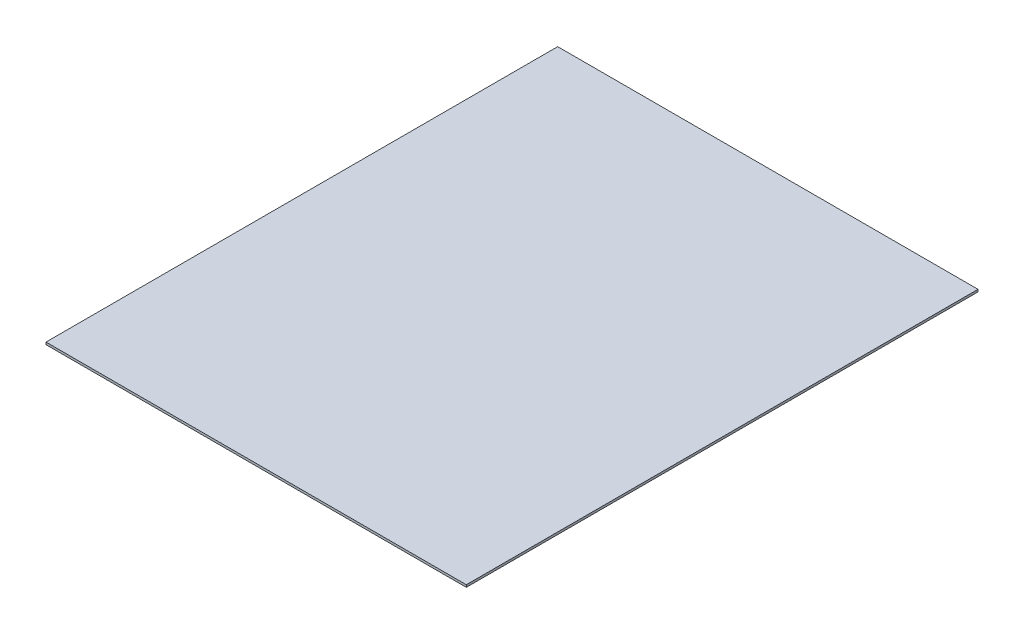
ISO-10303-21;
HEADER;
FILE_DESCRIPTION(('STEP AP214'),'2;1');
FILE_NAME('part.step','',(''),(''),'','','');
FILE_SCHEMA(('AUTOMOTIVE_DESIGN { 1 0 10303 214 1 1 1 1 }'));
ENDSEC;
DATA;
#1=APPLICATION_CONTEXT('core data for automotive mechanical design processes');
#2=APPLICATION_PROTOCOL_DEFINITION('international standard','automotive_design',2000,#1);
#3=PRODUCT_CONTEXT('',#1,'mechanical');
#4=PRODUCT('Part','Part','',(#3));
#5=PRODUCT_RELATED_PRODUCT_CATEGORY('part','',(#4));
#6=PRODUCT_DEFINITION_FORMATION('','',#4);
#7=PRODUCT_DEFINITION_CONTEXT('part definition',#1,'design');
#8=PRODUCT_DEFINITION('design','',#6,#7);
#9=PRODUCT_DEFINITION_SHAPE('','',#8);
#10=(LENGTH_UNIT() NAMED_UNIT(*) SI_UNIT(.MILLI.,.METRE.));
#11=(NAMED_UNIT(*) PLANE_ANGLE_UNIT() SI_UNIT($,.RADIAN.));
#12=(NAMED_UNIT(*) SI_UNIT($,.STERADIAN.) SOLID_ANGLE_UNIT());
#13=UNCERTAINTY_MEASURE_WITH_UNIT(LENGTH_MEASURE(1.E-05),#10,'distance_accuracy_value','');
#14=(GEOMETRIC_REPRESENTATION_CONTEXT(3) GLOBAL_UNCERTAINTY_ASSIGNED_CONTEXT((#13)) GLOBAL_UNIT_ASSIGNED_CONTEXT((#10,
#11,#12)) REPRESENTATION_CONTEXT('',''));
#15=CARTESIAN_POINT('',(0.,0.,0.));
#16=DIRECTION('',(0.,0.,1.));
#17=DIRECTION('',(1.,0.,0.));
#18=AXIS2_PLACEMENT_3D('',#15,#16,#17);
#19=CARTESIAN_POINT('',(-292.1,-28.5749999999999,-355.6));
#20=DIRECTION('',(-1.,0.,0.));
#21=DIRECTION('',(0.,0.,1.));
#22=AXIS2_PLACEMENT_3D('',#19,#20,#21);
#23=PLANE('',#22);
#24=DIRECTION('',(0.,0.,1.));
#25=VECTOR('',#24,1.);
#26=CARTESIAN_POINT('',(-292.1,-25.3999999999999,-355.6));
#27=LINE('',#26,#25);
#28=CARTESIAN_POINT('',(-292.1,-25.3999999999999,-355.6));
#29=VERTEX_POINT('',#28);
#30=CARTESIAN_POINT('',(-292.1,-25.3999999999999,355.6));
#31=VERTEX_POINT('',#30);
#32=EDGE_CURVE('E99',#29,#31,#27,.T.);
#33=ORIENTED_EDGE('',*,*,#32,.F.);
#34=DIRECTION('',(0.,1.,0.));
#35=VECTOR('',#34,1.);
#36=CARTESIAN_POINT('',(-292.1,-28.5749999999999,-355.6));
#37=LINE('',#36,#35);
#38=CARTESIAN_POINT('',(-292.1,-28.5749999999999,-355.6));
#39=VERTEX_POINT('',#38);
#40=EDGE_CURVE('E11',#39,#29,#37,.T.);
#41=ORIENTED_EDGE('',*,*,#40,.F.);
#42=DIRECTION('',(0.,0.,1.));
#43=VECTOR('',#42,1.);
#44=CARTESIAN_POINT('',(-292.1,-28.5749999999999,-355.6));
#45=LINE('',#44,#43);
#46=CARTESIAN_POINT('',(-292.1,-28.5749999999999,355.6));
#47=VERTEX_POINT('',#46);
#48=EDGE_CURVE('E93',#39,#47,#45,.T.);
#49=ORIENTED_EDGE('',*,*,#48,.T.);
#50=DIRECTION('',(0.,1.,0.));
#51=VECTOR('',#50,1.);
#52=CARTESIAN_POINT('',(-292.1,-28.5749999999999,355.6));
#53=LINE('',#52,#51);
#54=EDGE_CURVE('E38',#47,#31,#53,.T.);
#55=ORIENTED_EDGE('',*,*,#54,.T.);
#56=EDGE_LOOP('',(#33,#41,#49,#55));
#57=FACE_BOUND('',#56,.T.);
#58=ADVANCED_FACE('F35',(#57),#23,.T.);
#59=CARTESIAN_POINT('',(292.1,-28.5749999999999,-355.6));
#60=DIRECTION('',(0.,0.,-1.));
#61=DIRECTION('',(-1.,0.,0.));
#62=AXIS2_PLACEMENT_3D('',#59,#60,#61);
#63=PLANE('',#62);
#64=DIRECTION('',(-1.,0.,0.));
#65=VECTOR('',#64,1.);
#66=CARTESIAN_POINT('',(292.1,-25.3999999999999,-355.6));
#67=LINE('',#66,#65);
#68=CARTESIAN_POINT('',(292.1,-25.3999999999999,-355.6));
#69=VERTEX_POINT('',#68);
#70=EDGE_CURVE('E95',#69,#29,#67,.T.);
#71=ORIENTED_EDGE('',*,*,#70,.F.);
#72=DIRECTION('',(0.,1.,0.));
#73=VECTOR('',#72,1.);
#74=CARTESIAN_POINT('',(292.1,-28.5749999999999,-355.6));
#75=LINE('',#74,#73);
#76=CARTESIAN_POINT('',(292.1,-28.5749999999999,-355.6));
#77=VERTEX_POINT('',#76);
#78=EDGE_CURVE('E44',#77,#69,#75,.T.);
#79=ORIENTED_EDGE('',*,*,#78,.F.);
#80=DIRECTION('',(-1.,0.,0.));
#81=VECTOR('',#80,1.);
#82=CARTESIAN_POINT('',(292.1,-28.5749999999999,-355.6));
#83=LINE('',#82,#81);
#84=EDGE_CURVE('E90',#77,#39,#83,.T.);
#85=ORIENTED_EDGE('',*,*,#84,.T.);
#86=ORIENTED_EDGE('',*,*,#40,.T.);
#87=EDGE_LOOP('',(#71,#79,#85,#86));
#88=FACE_BOUND('',#87,.T.);
#89=ADVANCED_FACE('F109',(#88),#63,.T.);
#90=CARTESIAN_POINT('',(292.1,-28.5749999999999,-355.6));
#91=DIRECTION('',(1.,0.,0.));
#92=DIRECTION('',(0.,0.,-1.));
#93=AXIS2_PLACEMENT_3D('',#90,#91,#92);
#94=PLANE('',#93);
#95=DIRECTION('',(0.,0.,-1.));
#96=VECTOR('',#95,1.);
#97=CARTESIAN_POINT('',(292.1,-25.3999999999999,-355.6));
#98=LINE('',#97,#96);
#99=CARTESIAN_POINT('',(292.1,-25.3999999999999,355.6));
#100=VERTEX_POINT('',#99);
#101=EDGE_CURVE('E85',#100,#69,#98,.T.);
#102=ORIENTED_EDGE('',*,*,#101,.F.);
#103=DIRECTION('',(0.,1.,0.));
#104=VECTOR('',#103,1.);
#105=CARTESIAN_POINT('',(292.1,-28.5749999999999,355.6));
#106=LINE('',#105,#104);
#107=CARTESIAN_POINT('',(292.1,-28.5749999999999,355.6));
#108=VERTEX_POINT('',#107);
#109=EDGE_CURVE('E80',#108,#100,#106,.T.);
#110=ORIENTED_EDGE('',*,*,#109,.F.);
#111=DIRECTION('',(0.,0.,-1.));
#112=VECTOR('',#111,1.);
#113=CARTESIAN_POINT('',(292.1,-28.5749999999999,-355.6));
#114=LINE('',#113,#112);
#115=EDGE_CURVE('E83',#108,#77,#114,.T.);
#116=ORIENTED_EDGE('',*,*,#115,.T.);
#117=ORIENTED_EDGE('',*,*,#78,.T.);
#118=EDGE_LOOP('',(#102,#110,#116,#117));
#119=FACE_BOUND('',#118,.T.);
#120=ADVANCED_FACE('F82',(#119),#94,.T.);
#121=CARTESIAN_POINT('',(292.1,-28.5749999999999,355.6));
#122=DIRECTION('',(0.,0.,1.));
#123=DIRECTION('',(1.,0.,0.));
#124=AXIS2_PLACEMENT_3D('',#121,#122,#123);
#125=PLANE('',#124);
#126=DIRECTION('',(1.,0.,0.));
#127=VECTOR('',#126,1.);
#128=CARTESIAN_POINT('',(292.1,-25.3999999999999,355.6));
#129=LINE('',#128,#127);
#130=EDGE_CURVE('E102',#31,#100,#129,.T.);
#131=ORIENTED_EDGE('',*,*,#130,.F.);
#132=ORIENTED_EDGE('',*,*,#54,.F.);
#133=DIRECTION('',(1.,0.,0.));
#134=VECTOR('',#133,1.);
#135=CARTESIAN_POINT('',(292.1,-28.5749999999999,355.6));
#136=LINE('',#135,#134);
#137=EDGE_CURVE('E89',#47,#108,#136,.T.);
#138=ORIENTED_EDGE('',*,*,#137,.T.);
#139=ORIENTED_EDGE('',*,*,#109,.T.);
#140=EDGE_LOOP('',(#131,#132,#138,#139));
#141=FACE_BOUND('',#140,.T.);
#142=ADVANCED_FACE('F92',(#141),#125,.T.);
#143=CARTESIAN_POINT('',(0.,-28.5749999999999,0.));
#144=DIRECTION('',(0.,-1.,0.));
#145=DIRECTION('',(0.,0.,-1.));
#146=AXIS2_PLACEMENT_3D('',#143,#144,#145);
#147=PLANE('',#146);
#148=ORIENTED_EDGE('',*,*,#48,.F.);
#149=ORIENTED_EDGE('',*,*,#84,.F.);
#150=ORIENTED_EDGE('',*,*,#115,.F.);
#151=ORIENTED_EDGE('',*,*,#137,.F.);
#152=EDGE_LOOP('',(#148,#149,#150,#151));
#153=FACE_BOUND('',#152,.T.);
#154=ADVANCED_FACE('F88',(#153),#147,.T.);
#155=CARTESIAN_POINT('',(0.,-25.3999999999999,0.));
#156=DIRECTION('',(0.,-1.,0.));
#157=DIRECTION('',(0.,0.,-1.));
#158=AXIS2_PLACEMENT_3D('',#155,#156,#157);
#159=PLANE('',#158);
#160=ORIENTED_EDGE('',*,*,#32,.T.);
#161=ORIENTED_EDGE('',*,*,#130,.T.);
#162=ORIENTED_EDGE('',*,*,#101,.T.);
#163=ORIENTED_EDGE('',*,*,#70,.T.);
#164=EDGE_LOOP('',(#160,#161,#162,#163));
#165=FACE_BOUND('',#164,.T.);
#166=ADVANCED_FACE('F108',(#165),#159,.F.);
#167=CLOSED_SHELL('',(#58,#89,#120,#142,#154,#166));
#168=MANIFOLD_SOLID_BREP('B2',#167);
#169=ADVANCED_BREP_SHAPE_REPRESENTATION('',(#18,#168),#14);
#170=SHAPE_DEFINITION_REPRESENTATION(#9,#169);
ENDSEC;
END-ISO-10303-21;
